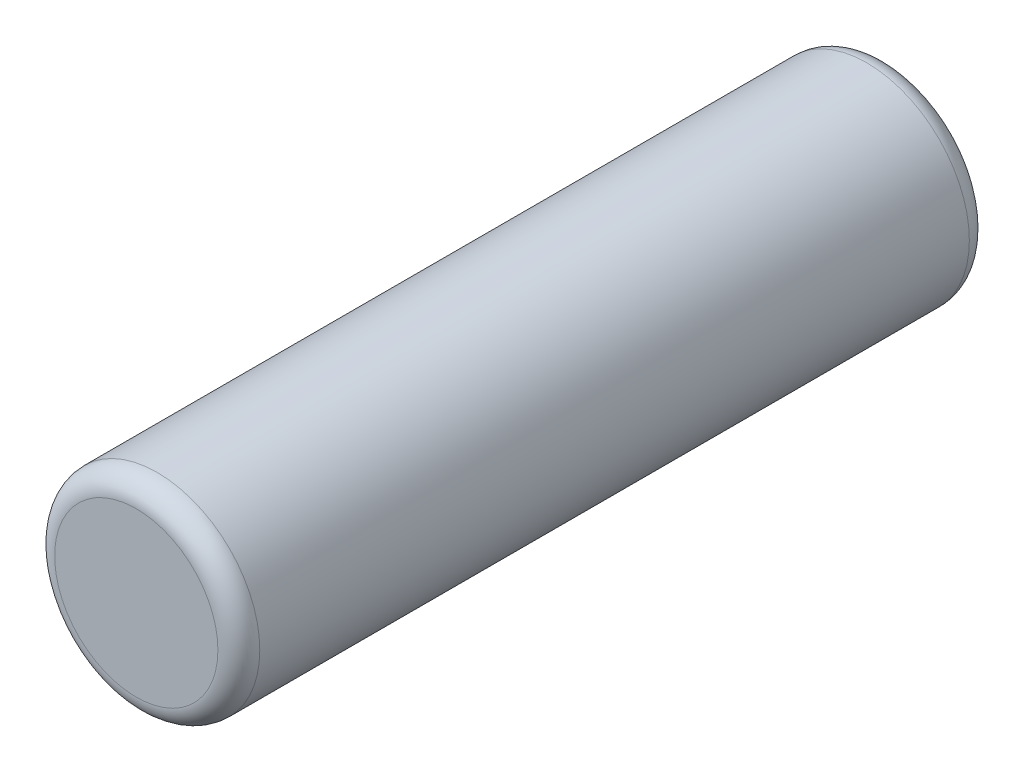
ISO-10303-21;
HEADER;
FILE_DESCRIPTION(('STEP AP214'),'2;1');
FILE_NAME('part.step','',(''),(''),'','','');
FILE_SCHEMA(('AUTOMOTIVE_DESIGN { 1 0 10303 214 1 1 1 1 }'));
ENDSEC;
DATA;
#1=APPLICATION_CONTEXT('core data for automotive mechanical design processes');
#2=APPLICATION_PROTOCOL_DEFINITION('international standard','automotive_design',2000,#1);
#3=PRODUCT_CONTEXT('',#1,'mechanical');
#4=PRODUCT('Part','Part','',(#3));
#5=PRODUCT_RELATED_PRODUCT_CATEGORY('part','',(#4));
#6=PRODUCT_DEFINITION_FORMATION('','',#4);
#7=PRODUCT_DEFINITION_CONTEXT('part definition',#1,'design');
#8=PRODUCT_DEFINITION('design','',#6,#7);
#9=PRODUCT_DEFINITION_SHAPE('','',#8);
#10=(LENGTH_UNIT() NAMED_UNIT(*) SI_UNIT(.MILLI.,.METRE.));
#11=(NAMED_UNIT(*) PLANE_ANGLE_UNIT() SI_UNIT($,.RADIAN.));
#12=(NAMED_UNIT(*) SI_UNIT($,.STERADIAN.) SOLID_ANGLE_UNIT());
#13=UNCERTAINTY_MEASURE_WITH_UNIT(LENGTH_MEASURE(1.E-05),#10,'distance_accuracy_value','');
#14=(GEOMETRIC_REPRESENTATION_CONTEXT(3) GLOBAL_UNCERTAINTY_ASSIGNED_CONTEXT((#13)) GLOBAL_UNIT_ASSIGNED_CONTEXT((#10,
#11,#12)) REPRESENTATION_CONTEXT('',''));
#15=CARTESIAN_POINT('',(0.,0.,0.));
#16=DIRECTION('',(0.,0.,1.));
#17=DIRECTION('',(1.,0.,0.));
#18=AXIS2_PLACEMENT_3D('',#15,#16,#17);
#19=CARTESIAN_POINT('',(0.,0.,17.95));
#20=DIRECTION('',(0.,0.,-1.));
#21=DIRECTION('',(-1.,0.,0.));
#22=AXIS2_PLACEMENT_3D('',#19,#20,#21);
#23=CYLINDRICAL_SURFACE('',#22,2.45);
#24=CARTESIAN_POINT('',(0.,0.,0.5));
#25=DIRECTION('',(0.,0.,1.));
#26=DIRECTION('',(1.,0.,0.));
#27=AXIS2_PLACEMENT_3D('',#24,#25,#26);
#28=CIRCLE('',#27,2.45);
#29=CARTESIAN_POINT('',(2.45,0.,0.5));
#30=VERTEX_POINT('',#29);
#31=EDGE_CURVE('E42',#30,#30,#28,.T.);
#32=ORIENTED_EDGE('',*,*,#31,.T.);
#33=EDGE_LOOP('',(#32));
#34=FACE_BOUND('',#33,.T.);
#35=CARTESIAN_POINT('',(0.,0.,17.45));
#36=DIRECTION('',(0.,0.,1.));
#37=DIRECTION('',(1.,0.,0.));
#38=AXIS2_PLACEMENT_3D('',#35,#36,#37);
#39=CIRCLE('',#38,2.45);
#40=CARTESIAN_POINT('',(2.45,0.,17.45));
#41=VERTEX_POINT('',#40);
#42=EDGE_CURVE('E46',#41,#41,#39,.F.);
#43=ORIENTED_EDGE('',*,*,#42,.T.);
#44=EDGE_LOOP('',(#43));
#45=FACE_BOUND('',#44,.T.);
#46=ADVANCED_FACE('F31',(#34,#45),#23,.T.);
#47=CARTESIAN_POINT('',(0.,0.,17.95));
#48=DIRECTION('',(0.,0.,1.));
#49=DIRECTION('',(1.,0.,0.));
#50=AXIS2_PLACEMENT_3D('',#47,#48,#49);
#51=PLANE('',#50);
#52=CARTESIAN_POINT('',(0.,0.,17.95));
#53=DIRECTION('',(0.,0.,1.));
#54=DIRECTION('',(1.,0.,0.));
#55=AXIS2_PLACEMENT_3D('',#52,#53,#54);
#56=CIRCLE('',#55,1.95);
#57=CARTESIAN_POINT('',(1.95,0.,17.95));
#58=VERTEX_POINT('',#57);
#59=EDGE_CURVE('E10',#58,#58,#56,.T.);
#60=ORIENTED_EDGE('',*,*,#59,.T.);
#61=EDGE_LOOP('',(#60));
#62=FACE_BOUND('',#61,.T.);
#63=ADVANCED_FACE('F62',(#62),#51,.T.);
#64=CARTESIAN_POINT('',(0.,0.,0.));
#65=DIRECTION('',(0.,0.,1.));
#66=DIRECTION('',(1.,0.,0.));
#67=AXIS2_PLACEMENT_3D('',#64,#65,#66);
#68=PLANE('',#67);
#69=CARTESIAN_POINT('',(0.,0.,0.));
#70=DIRECTION('',(0.,0.,1.));
#71=DIRECTION('',(1.,0.,0.));
#72=AXIS2_PLACEMENT_3D('',#69,#70,#71);
#73=CIRCLE('',#72,1.95);
#74=CARTESIAN_POINT('',(1.95,0.,0.));
#75=VERTEX_POINT('',#74);
#76=EDGE_CURVE('E38',#75,#75,#73,.F.);
#77=ORIENTED_EDGE('',*,*,#76,.T.);
#78=EDGE_LOOP('',(#77));
#79=FACE_BOUND('',#78,.T.);
#80=ADVANCED_FACE('F59',(#79),#68,.F.);
#81=CARTESIAN_POINT('',(0.,0.,0.5));
#82=DIRECTION('',(0.,0.,1.));
#83=DIRECTION('',(1.,0.,0.));
#84=AXIS2_PLACEMENT_3D('',#81,#82,#83);
#85=TOROIDAL_SURFACE('',#84,1.95,0.5);
#86=ORIENTED_EDGE('',*,*,#76,.F.);
#87=EDGE_LOOP('',(#86));
#88=FACE_BOUND('',#87,.T.);
#89=ORIENTED_EDGE('',*,*,#31,.F.);
#90=EDGE_LOOP('',(#89));
#91=FACE_BOUND('',#90,.T.);
#92=ADVANCED_FACE('F55',(#88,#91),#85,.T.);
#93=CARTESIAN_POINT('',(0.,0.,17.45));
#94=DIRECTION('',(0.,0.,1.));
#95=DIRECTION('',(1.,0.,0.));
#96=AXIS2_PLACEMENT_3D('',#93,#94,#95);
#97=TOROIDAL_SURFACE('',#96,1.95,0.5);
#98=ORIENTED_EDGE('',*,*,#42,.F.);
#99=EDGE_LOOP('',(#98));
#100=FACE_BOUND('',#99,.T.);
#101=ORIENTED_EDGE('',*,*,#59,.F.);
#102=EDGE_LOOP('',(#101));
#103=FACE_BOUND('',#102,.T.);
#104=ADVANCED_FACE('F33',(#100,#103),#97,.T.);
#105=CLOSED_SHELL('',(#46,#63,#80,#92,#104));
#106=MANIFOLD_SOLID_BREP('B2',#105);
#107=ADVANCED_BREP_SHAPE_REPRESENTATION('',(#18,#106),#14);
#108=SHAPE_DEFINITION_REPRESENTATION(#9,#107);
ENDSEC;
END-ISO-10303-21;
